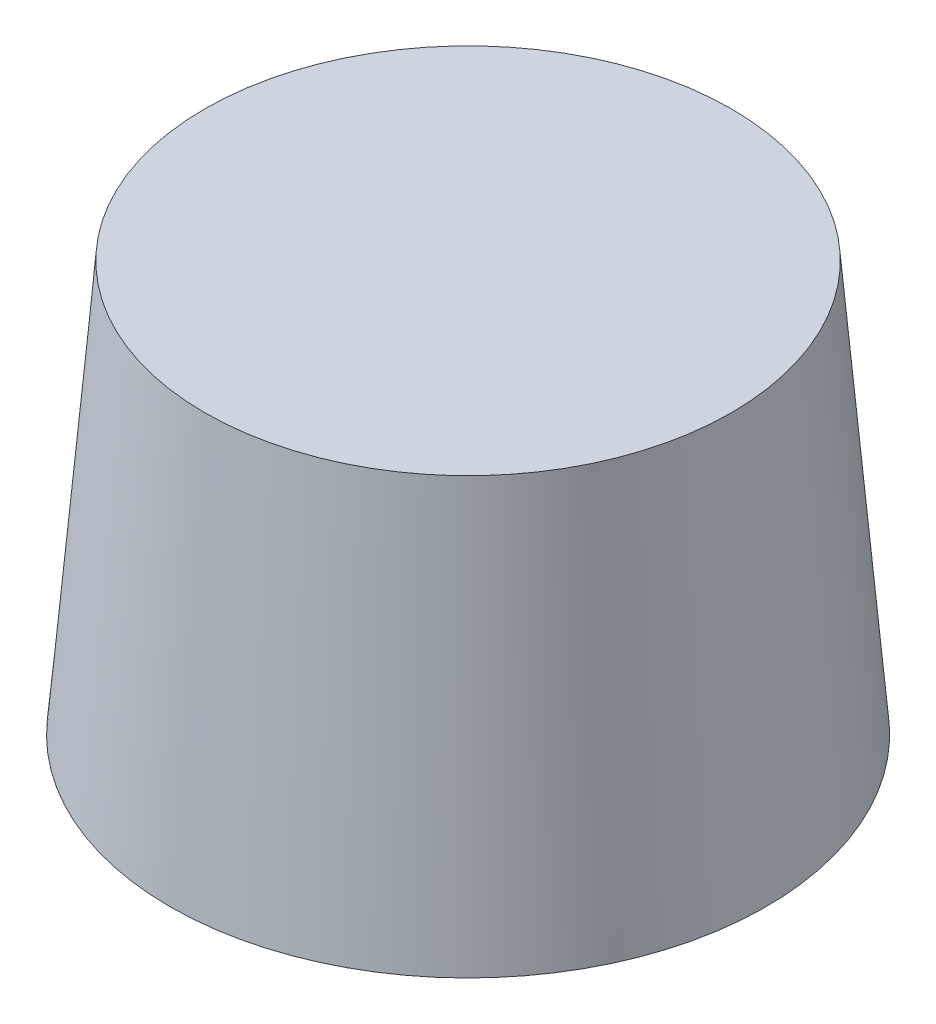
ISO-10303-21;
HEADER;
FILE_DESCRIPTION(('STEP AP214'),'2;1');
FILE_NAME('part.step','',(''),(''),'','','');
FILE_SCHEMA(('AUTOMOTIVE_DESIGN { 1 0 10303 214 1 1 1 1 }'));
ENDSEC;
DATA;
#1=APPLICATION_CONTEXT('core data for automotive mechanical design processes');
#2=APPLICATION_PROTOCOL_DEFINITION('international standard','automotive_design',2000,#1);
#3=PRODUCT_CONTEXT('',#1,'mechanical');
#4=PRODUCT('Part','Part','',(#3));
#5=PRODUCT_RELATED_PRODUCT_CATEGORY('part','',(#4));
#6=PRODUCT_DEFINITION_FORMATION('','',#4);
#7=PRODUCT_DEFINITION_CONTEXT('part definition',#1,'design');
#8=PRODUCT_DEFINITION('design','',#6,#7);
#9=PRODUCT_DEFINITION_SHAPE('','',#8);
#10=(LENGTH_UNIT() NAMED_UNIT(*) SI_UNIT(.MILLI.,.METRE.));
#11=(NAMED_UNIT(*) PLANE_ANGLE_UNIT() SI_UNIT($,.RADIAN.));
#12=(NAMED_UNIT(*) SI_UNIT($,.STERADIAN.) SOLID_ANGLE_UNIT());
#13=UNCERTAINTY_MEASURE_WITH_UNIT(LENGTH_MEASURE(1.E-05),#10,'distance_accuracy_value','');
#14=(GEOMETRIC_REPRESENTATION_CONTEXT(3) GLOBAL_UNCERTAINTY_ASSIGNED_CONTEXT((#13)) GLOBAL_UNIT_ASSIGNED_CONTEXT((#10,
#11,#12)) REPRESENTATION_CONTEXT('',''));
#15=CARTESIAN_POINT('',(0.,0.,0.));
#16=DIRECTION('',(0.,0.,1.));
#17=DIRECTION('',(1.,0.,0.));
#18=AXIS2_PLACEMENT_3D('',#15,#16,#17);
#19=CARTESIAN_POINT('',(0.,0.,0.));
#20=DIRECTION('',(0.,-1.,0.));
#21=DIRECTION('',(0.,0.,-1.));
#22=AXIS2_PLACEMENT_3D('',#19,#20,#21);
#23=CONICAL_SURFACE('',#22,38.5,0.0847025108696577);
#24=CARTESIAN_POINT('',(0.,53.,0.));
#25=DIRECTION('',(0.,1.,0.));
#26=DIRECTION('',(0.,0.,1.));
#27=AXIS2_PLACEMENT_3D('',#24,#25,#26);
#28=CIRCLE('',#27,34.);
#29=CARTESIAN_POINT('',(0.,53.,34.));
#30=VERTEX_POINT('',#29);
#31=EDGE_CURVE('E44',#30,#30,#28,.T.);
#32=ORIENTED_EDGE('',*,*,#31,.F.);
#33=EDGE_LOOP('',(#32));
#34=FACE_BOUND('',#33,.T.);
#35=CARTESIAN_POINT('',(0.,0.,0.));
#36=DIRECTION('',(0.,1.,0.));
#37=DIRECTION('',(0.,0.,1.));
#38=AXIS2_PLACEMENT_3D('',#35,#36,#37);
#39=CIRCLE('',#38,38.5);
#40=CARTESIAN_POINT('',(0.,0.,38.5));
#41=VERTEX_POINT('',#40);
#42=EDGE_CURVE('E10',#41,#41,#39,.T.);
#43=ORIENTED_EDGE('',*,*,#42,.T.);
#44=EDGE_LOOP('',(#43));
#45=FACE_BOUND('',#44,.T.);
#46=ADVANCED_FACE('F37',(#34,#45),#23,.T.);
#47=CARTESIAN_POINT('',(38.5,0.,0.));
#48=DIRECTION('',(0.,1.,0.));
#49=DIRECTION('',(0.,0.,1.));
#50=AXIS2_PLACEMENT_3D('',#47,#48,#49);
#51=PLANE('',#50);
#52=ORIENTED_EDGE('',*,*,#42,.F.);
#53=EDGE_LOOP('',(#52));
#54=FACE_BOUND('',#53,.T.);
#55=ADVANCED_FACE('F53',(#54),#51,.F.);
#56=CARTESIAN_POINT('',(0.,53.,0.));
#57=DIRECTION('',(0.,-1.,0.));
#58=DIRECTION('',(0.,0.,-1.));
#59=AXIS2_PLACEMENT_3D('',#56,#57,#58);
#60=PLANE('',#59);
#61=ORIENTED_EDGE('',*,*,#31,.T.);
#62=EDGE_LOOP('',(#61));
#63=FACE_BOUND('',#62,.T.);
#64=ADVANCED_FACE('F50',(#63),#60,.F.);
#65=CLOSED_SHELL('',(#46,#55,#64));
#66=MANIFOLD_SOLID_BREP('B2',#65);
#67=ADVANCED_BREP_SHAPE_REPRESENTATION('',(#18,#66),#14);
#68=SHAPE_DEFINITION_REPRESENTATION(#9,#67);
ENDSEC;
END-ISO-10303-21;
